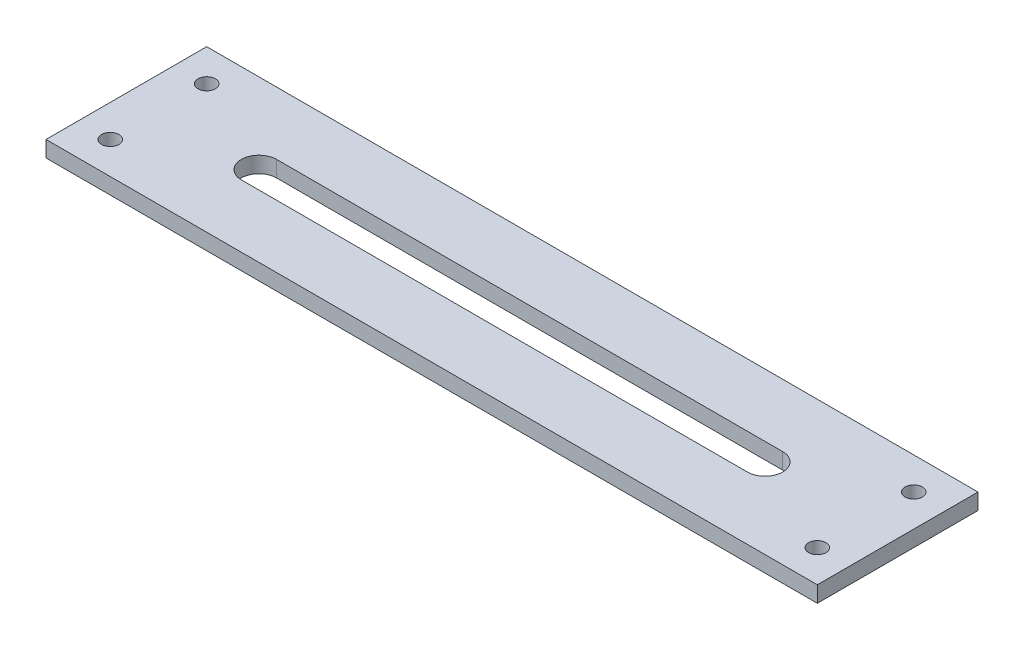
ISO-10303-21;
HEADER;
FILE_DESCRIPTION(('STEP AP214'),'2;1');
FILE_NAME('part.step','',(''),(''),'','','');
FILE_SCHEMA(('AUTOMOTIVE_DESIGN { 1 0 10303 214 1 1 1 1 }'));
ENDSEC;
DATA;
#1=APPLICATION_CONTEXT('core data for automotive mechanical design processes');
#2=APPLICATION_PROTOCOL_DEFINITION('international standard','automotive_design',2000,#1);
#3=PRODUCT_CONTEXT('',#1,'mechanical');
#4=PRODUCT('Part','Part','',(#3));
#5=PRODUCT_RELATED_PRODUCT_CATEGORY('part','',(#4));
#6=PRODUCT_DEFINITION_FORMATION('','',#4);
#7=PRODUCT_DEFINITION_CONTEXT('part definition',#1,'design');
#8=PRODUCT_DEFINITION('design','',#6,#7);
#9=PRODUCT_DEFINITION_SHAPE('','',#8);
#10=(LENGTH_UNIT() NAMED_UNIT(*) SI_UNIT(.MILLI.,.METRE.));
#11=(NAMED_UNIT(*) PLANE_ANGLE_UNIT() SI_UNIT($,.RADIAN.));
#12=(NAMED_UNIT(*) SI_UNIT($,.STERADIAN.) SOLID_ANGLE_UNIT());
#13=UNCERTAINTY_MEASURE_WITH_UNIT(LENGTH_MEASURE(1.E-05),#10,'distance_accuracy_value','');
#14=(GEOMETRIC_REPRESENTATION_CONTEXT(3) GLOBAL_UNCERTAINTY_ASSIGNED_CONTEXT((#13)) GLOBAL_UNIT_ASSIGNED_CONTEXT((#10,
#11,#12)) REPRESENTATION_CONTEXT('',''));
#15=CARTESIAN_POINT('',(0.,0.,0.));
#16=DIRECTION('',(0.,0.,1.));
#17=DIRECTION('',(1.,0.,0.));
#18=AXIS2_PLACEMENT_3D('',#15,#16,#17);
#19=CARTESIAN_POINT('',(0.,6.35,0.));
#20=DIRECTION('',(0.,-1.,0.));
#21=DIRECTION('',(0.,0.,-1.));
#22=AXIS2_PLACEMENT_3D('',#19,#20,#21);
#23=PLANE('',#22);
#24=DIRECTION('',(0.,0.,1.));
#25=VECTOR('',#24,1.);
#26=CARTESIAN_POINT('',(-152.4,6.35,-31.75));
#27=LINE('',#26,#25);
#28=CARTESIAN_POINT('',(-152.4,6.35,-31.75));
#29=VERTEX_POINT('',#28);
#30=CARTESIAN_POINT('',(-152.4,6.35,31.75));
#31=VERTEX_POINT('',#30);
#32=EDGE_CURVE('E137',#29,#31,#27,.T.);
#33=ORIENTED_EDGE('',*,*,#32,.T.);
#34=DIRECTION('',(1.,0.,0.));
#35=VECTOR('',#34,1.);
#36=CARTESIAN_POINT('',(152.4,6.35,31.75));
#37=LINE('',#36,#35);
#38=CARTESIAN_POINT('',(152.4,6.35,31.75));
#39=VERTEX_POINT('',#38);
#40=EDGE_CURVE('E140',#31,#39,#37,.T.);
#41=ORIENTED_EDGE('',*,*,#40,.T.);
#42=DIRECTION('',(0.,0.,-1.));
#43=VECTOR('',#42,1.);
#44=CARTESIAN_POINT('',(152.4,6.35,-31.75));
#45=LINE('',#44,#43);
#46=CARTESIAN_POINT('',(152.4,6.35,-31.75));
#47=VERTEX_POINT('',#46);
#48=EDGE_CURVE('E143',#39,#47,#45,.T.);
#49=ORIENTED_EDGE('',*,*,#48,.T.);
#50=DIRECTION('',(-1.,0.,0.));
#51=VECTOR('',#50,1.);
#52=CARTESIAN_POINT('',(152.4,6.35,-31.75));
#53=LINE('',#52,#51);
#54=EDGE_CURVE('E145',#47,#29,#53,.T.);
#55=ORIENTED_EDGE('',*,*,#54,.T.);
#56=EDGE_LOOP('',(#33,#41,#49,#55));
#57=FACE_BOUND('',#56,.T.);
#58=CARTESIAN_POINT('',(-100.,6.35,0.));
#59=DIRECTION('',(0.,1.,0.));
#60=DIRECTION('',(0.,0.,1.));
#61=AXIS2_PLACEMENT_3D('',#58,#59,#60);
#62=CIRCLE('',#61,6.985);
#63=CARTESIAN_POINT('',(-100.,6.35,-6.985));
#64=VERTEX_POINT('',#63);
#65=CARTESIAN_POINT('',(-100.,6.35,6.985));
#66=VERTEX_POINT('',#65);
#67=EDGE_CURVE('E98',#64,#66,#62,.T.);
#68=ORIENTED_EDGE('',*,*,#67,.F.);
#69=DIRECTION('',(-1.,0.,0.));
#70=VECTOR('',#69,1.);
#71=CARTESIAN_POINT('',(-100.,6.35,-6.985));
#72=LINE('',#71,#70);
#73=CARTESIAN_POINT('',(100.,6.35,-6.985));
#74=VERTEX_POINT('',#73);
#75=EDGE_CURVE('E121',#74,#64,#72,.T.);
#76=ORIENTED_EDGE('',*,*,#75,.F.);
#77=CARTESIAN_POINT('',(100.,6.35,0.));
#78=DIRECTION('',(0.,1.,0.));
#79=DIRECTION('',(0.,0.,1.));
#80=AXIS2_PLACEMENT_3D('',#77,#78,#79);
#81=CIRCLE('',#80,6.985);
#82=CARTESIAN_POINT('',(100.,6.35,6.98499999999996));
#83=VERTEX_POINT('',#82);
#84=EDGE_CURVE('E119',#83,#74,#81,.T.);
#85=ORIENTED_EDGE('',*,*,#84,.F.);
#86=DIRECTION('',(1.,0.,0.));
#87=VECTOR('',#86,1.);
#88=CARTESIAN_POINT('',(-100.,6.35,6.985));
#89=LINE('',#88,#87);
#90=EDGE_CURVE('E106',#66,#83,#89,.T.);
#91=ORIENTED_EDGE('',*,*,#90,.F.);
#92=EDGE_LOOP('',(#68,#76,#85,#91));
#93=FACE_BOUND('',#92,.T.);
#94=CARTESIAN_POINT('',(-139.7,6.35,-19.05));
#95=DIRECTION('',(0.,1.,0.));
#96=DIRECTION('',(0.,0.,1.));
#97=AXIS2_PLACEMENT_3D('',#94,#95,#96);
#98=CIRCLE('',#97,3.429);
#99=CARTESIAN_POINT('',(-139.7,6.35,-15.621));
#100=VERTEX_POINT('',#99);
#101=EDGE_CURVE('E127',#100,#100,#98,.T.);
#102=ORIENTED_EDGE('',*,*,#101,.F.);
#103=EDGE_LOOP('',(#102));
#104=FACE_BOUND('',#103,.T.);
#105=CARTESIAN_POINT('',(139.7,6.35,-19.0499999999993));
#106=DIRECTION('',(0.,1.,0.));
#107=DIRECTION('',(0.,0.,-1.));
#108=AXIS2_PLACEMENT_3D('',#105,#106,#107);
#109=CIRCLE('',#108,3.429);
#110=CARTESIAN_POINT('',(139.7,6.35,-22.4789999999992));
#111=VERTEX_POINT('',#110);
#112=EDGE_CURVE('E249',#111,#111,#109,.T.);
#113=ORIENTED_EDGE('',*,*,#112,.F.);
#114=EDGE_LOOP('',(#113));
#115=FACE_BOUND('',#114,.T.);
#116=CARTESIAN_POINT('',(139.7,6.35,19.049999999999));
#117=DIRECTION('',(0.,1.,0.));
#118=DIRECTION('',(0.,0.,1.));
#119=AXIS2_PLACEMENT_3D('',#116,#117,#118);
#120=CIRCLE('',#119,3.429);
#121=CARTESIAN_POINT('',(139.7,6.35,22.478999999999));
#122=VERTEX_POINT('',#121);
#123=EDGE_CURVE('E243',#122,#122,#120,.T.);
#124=ORIENTED_EDGE('',*,*,#123,.F.);
#125=EDGE_LOOP('',(#124));
#126=FACE_BOUND('',#125,.T.);
#127=CARTESIAN_POINT('',(-139.7,6.35,19.05));
#128=DIRECTION('',(0.,1.,0.));
#129=DIRECTION('',(0.,0.,-1.));
#130=AXIS2_PLACEMENT_3D('',#127,#128,#129);
#131=CIRCLE('',#130,3.429);
#132=CARTESIAN_POINT('',(-139.7,6.35,15.621));
#133=VERTEX_POINT('',#132);
#134=EDGE_CURVE('E234',#133,#133,#131,.T.);
#135=ORIENTED_EDGE('',*,*,#134,.F.);
#136=EDGE_LOOP('',(#135));
#137=FACE_BOUND('',#136,.T.);
#138=ADVANCED_FACE('F33',(#57,#93,#104,#115,#126,#137),#23,.F.);
#139=CARTESIAN_POINT('',(0.,0.,0.));
#140=DIRECTION('',(0.,-1.,0.));
#141=DIRECTION('',(0.,0.,-1.));
#142=AXIS2_PLACEMENT_3D('',#139,#140,#141);
#143=PLANE('',#142);
#144=CARTESIAN_POINT('',(139.7,0.,19.049999999999));
#145=DIRECTION('',(0.,1.,0.));
#146=DIRECTION('',(0.,0.,1.));
#147=AXIS2_PLACEMENT_3D('',#144,#145,#146);
#148=CIRCLE('',#147,3.429);
#149=CARTESIAN_POINT('',(139.7,0.,22.478999999999));
#150=VERTEX_POINT('',#149);
#151=EDGE_CURVE('E240',#150,#150,#148,.T.);
#152=ORIENTED_EDGE('',*,*,#151,.T.);
#153=EDGE_LOOP('',(#152));
#154=FACE_BOUND('',#153,.T.);
#155=CARTESIAN_POINT('',(-139.7,0.,-19.05));
#156=DIRECTION('',(0.,1.,0.));
#157=DIRECTION('',(0.,0.,1.));
#158=AXIS2_PLACEMENT_3D('',#155,#156,#157);
#159=CIRCLE('',#158,3.429);
#160=CARTESIAN_POINT('',(-139.7,0.,-15.621));
#161=VERTEX_POINT('',#160);
#162=EDGE_CURVE('E252',#161,#161,#159,.T.);
#163=ORIENTED_EDGE('',*,*,#162,.T.);
#164=EDGE_LOOP('',(#163));
#165=FACE_BOUND('',#164,.T.);
#166=DIRECTION('',(0.,0.,1.));
#167=VECTOR('',#166,1.);
#168=CARTESIAN_POINT('',(-152.4,0.,-31.75));
#169=LINE('',#168,#167);
#170=CARTESIAN_POINT('',(-152.4,0.,-31.75));
#171=VERTEX_POINT('',#170);
#172=CARTESIAN_POINT('',(-152.4,0.,31.75));
#173=VERTEX_POINT('',#172);
#174=EDGE_CURVE('E114',#171,#173,#169,.T.);
#175=ORIENTED_EDGE('',*,*,#174,.F.);
#176=DIRECTION('',(-1.,0.,0.));
#177=VECTOR('',#176,1.);
#178=CARTESIAN_POINT('',(152.4,0.,-31.75));
#179=LINE('',#178,#177);
#180=CARTESIAN_POINT('',(152.4,0.,-31.75));
#181=VERTEX_POINT('',#180);
#182=EDGE_CURVE('E141',#181,#171,#179,.T.);
#183=ORIENTED_EDGE('',*,*,#182,.F.);
#184=DIRECTION('',(0.,0.,-1.));
#185=VECTOR('',#184,1.);
#186=CARTESIAN_POINT('',(152.4,0.,-31.75));
#187=LINE('',#186,#185);
#188=CARTESIAN_POINT('',(152.4,0.,31.75));
#189=VERTEX_POINT('',#188);
#190=EDGE_CURVE('E152',#189,#181,#187,.T.);
#191=ORIENTED_EDGE('',*,*,#190,.F.);
#192=DIRECTION('',(1.,0.,0.));
#193=VECTOR('',#192,1.);
#194=CARTESIAN_POINT('',(152.4,0.,31.75));
#195=LINE('',#194,#193);
#196=EDGE_CURVE('E150',#173,#189,#195,.T.);
#197=ORIENTED_EDGE('',*,*,#196,.F.);
#198=EDGE_LOOP('',(#175,#183,#191,#197));
#199=FACE_BOUND('',#198,.T.);
#200=DIRECTION('',(-1.,0.,0.));
#201=VECTOR('',#200,1.);
#202=CARTESIAN_POINT('',(-100.,0.,-6.985));
#203=LINE('',#202,#201);
#204=CARTESIAN_POINT('',(100.,0.,-6.985));
#205=VERTEX_POINT('',#204);
#206=CARTESIAN_POINT('',(-100.,0.,-6.985));
#207=VERTEX_POINT('',#206);
#208=EDGE_CURVE('E107',#205,#207,#203,.T.);
#209=ORIENTED_EDGE('',*,*,#208,.T.);
#210=CARTESIAN_POINT('',(-100.,0.,0.));
#211=DIRECTION('',(0.,1.,0.));
#212=DIRECTION('',(0.,0.,1.));
#213=AXIS2_PLACEMENT_3D('',#210,#211,#212);
#214=CIRCLE('',#213,6.985);
#215=CARTESIAN_POINT('',(-100.,0.,6.985));
#216=VERTEX_POINT('',#215);
#217=EDGE_CURVE('E56',#207,#216,#214,.T.);
#218=ORIENTED_EDGE('',*,*,#217,.T.);
#219=DIRECTION('',(1.,0.,0.));
#220=VECTOR('',#219,1.);
#221=CARTESIAN_POINT('',(-100.,0.,6.985));
#222=LINE('',#221,#220);
#223=CARTESIAN_POINT('',(100.,0.,6.98499999999996));
#224=VERTEX_POINT('',#223);
#225=EDGE_CURVE('E113',#216,#224,#222,.T.);
#226=ORIENTED_EDGE('',*,*,#225,.T.);
#227=CARTESIAN_POINT('',(100.,0.,0.));
#228=DIRECTION('',(0.,1.,0.));
#229=DIRECTION('',(0.,0.,1.));
#230=AXIS2_PLACEMENT_3D('',#227,#228,#229);
#231=CIRCLE('',#230,6.985);
#232=EDGE_CURVE('E129',#224,#205,#231,.T.);
#233=ORIENTED_EDGE('',*,*,#232,.T.);
#234=EDGE_LOOP('',(#209,#218,#226,#233));
#235=FACE_BOUND('',#234,.T.);
#236=CARTESIAN_POINT('',(139.7,0.,-19.0499999999993));
#237=DIRECTION('',(0.,1.,0.));
#238=DIRECTION('',(0.,0.,-1.));
#239=AXIS2_PLACEMENT_3D('',#236,#237,#238);
#240=CIRCLE('',#239,3.429);
#241=CARTESIAN_POINT('',(139.7,0.,-22.4789999999992));
#242=VERTEX_POINT('',#241);
#243=EDGE_CURVE('E246',#242,#242,#240,.T.);
#244=ORIENTED_EDGE('',*,*,#243,.T.);
#245=EDGE_LOOP('',(#244));
#246=FACE_BOUND('',#245,.T.);
#247=CARTESIAN_POINT('',(-139.7,0.,19.05));
#248=DIRECTION('',(0.,1.,0.));
#249=DIRECTION('',(0.,0.,-1.));
#250=AXIS2_PLACEMENT_3D('',#247,#248,#249);
#251=CIRCLE('',#250,3.429);
#252=CARTESIAN_POINT('',(-139.7,0.,15.621));
#253=VERTEX_POINT('',#252);
#254=EDGE_CURVE('E237',#253,#253,#251,.T.);
#255=ORIENTED_EDGE('',*,*,#254,.T.);
#256=EDGE_LOOP('',(#255));
#257=FACE_BOUND('',#256,.T.);
#258=ADVANCED_FACE('F170',(#154,#165,#199,#235,#246,#257),#143,.T.);
#259=CARTESIAN_POINT('',(-152.4,6.35,-31.75));
#260=DIRECTION('',(1.,0.,0.));
#261=DIRECTION('',(0.,0.,-1.));
#262=AXIS2_PLACEMENT_3D('',#259,#260,#261);
#263=PLANE('',#262);
#264=ORIENTED_EDGE('',*,*,#174,.T.);
#265=DIRECTION('',(0.,-1.,0.));
#266=VECTOR('',#265,1.);
#267=CARTESIAN_POINT('',(-152.4,6.35,31.75));
#268=LINE('',#267,#266);
#269=EDGE_CURVE('E11',#31,#173,#268,.T.);
#270=ORIENTED_EDGE('',*,*,#269,.F.);
#271=ORIENTED_EDGE('',*,*,#32,.F.);
#272=DIRECTION('',(0.,-1.,0.));
#273=VECTOR('',#272,1.);
#274=CARTESIAN_POINT('',(-152.4,6.35,-31.75));
#275=LINE('',#274,#273);
#276=EDGE_CURVE('E147',#29,#171,#275,.T.);
#277=ORIENTED_EDGE('',*,*,#276,.T.);
#278=EDGE_LOOP('',(#264,#270,#271,#277));
#279=FACE_BOUND('',#278,.T.);
#280=ADVANCED_FACE('F35',(#279),#263,.F.);
#281=CARTESIAN_POINT('',(152.4,6.35,31.75));
#282=DIRECTION('',(0.,0.,-1.));
#283=DIRECTION('',(-1.,0.,0.));
#284=AXIS2_PLACEMENT_3D('',#281,#282,#283);
#285=PLANE('',#284);
#286=ORIENTED_EDGE('',*,*,#196,.T.);
#287=DIRECTION('',(0.,-1.,0.));
#288=VECTOR('',#287,1.);
#289=CARTESIAN_POINT('',(152.4,6.35,31.75));
#290=LINE('',#289,#288);
#291=EDGE_CURVE('E41',#39,#189,#290,.T.);
#292=ORIENTED_EDGE('',*,*,#291,.F.);
#293=ORIENTED_EDGE('',*,*,#40,.F.);
#294=ORIENTED_EDGE('',*,*,#269,.T.);
#295=EDGE_LOOP('',(#286,#292,#293,#294));
#296=FACE_BOUND('',#295,.T.);
#297=ADVANCED_FACE('F180',(#296),#285,.F.);
#298=CARTESIAN_POINT('',(152.4,6.35,-31.75));
#299=DIRECTION('',(-1.,0.,0.));
#300=DIRECTION('',(0.,0.,1.));
#301=AXIS2_PLACEMENT_3D('',#298,#299,#300);
#302=PLANE('',#301);
#303=ORIENTED_EDGE('',*,*,#190,.T.);
#304=DIRECTION('',(0.,-1.,0.));
#305=VECTOR('',#304,1.);
#306=CARTESIAN_POINT('',(152.4,6.35,-31.75));
#307=LINE('',#306,#305);
#308=EDGE_CURVE('E157',#47,#181,#307,.T.);
#309=ORIENTED_EDGE('',*,*,#308,.F.);
#310=ORIENTED_EDGE('',*,*,#48,.F.);
#311=ORIENTED_EDGE('',*,*,#291,.T.);
#312=EDGE_LOOP('',(#303,#309,#310,#311));
#313=FACE_BOUND('',#312,.T.);
#314=ADVANCED_FACE('F164',(#313),#302,.F.);
#315=CARTESIAN_POINT('',(152.4,6.35,-31.75));
#316=DIRECTION('',(0.,0.,1.));
#317=DIRECTION('',(1.,0.,0.));
#318=AXIS2_PLACEMENT_3D('',#315,#316,#317);
#319=PLANE('',#318);
#320=ORIENTED_EDGE('',*,*,#182,.T.);
#321=ORIENTED_EDGE('',*,*,#276,.F.);
#322=ORIENTED_EDGE('',*,*,#54,.F.);
#323=ORIENTED_EDGE('',*,*,#308,.T.);
#324=EDGE_LOOP('',(#320,#321,#322,#323));
#325=FACE_BOUND('',#324,.T.);
#326=ADVANCED_FACE('F174',(#325),#319,.F.);
#327=CARTESIAN_POINT('',(-100.,6.35,0.));
#328=DIRECTION('',(0.,-1.,0.));
#329=DIRECTION('',(0.,0.,-1.));
#330=AXIS2_PLACEMENT_3D('',#327,#328,#329);
#331=CYLINDRICAL_SURFACE('',#330,6.985);
#332=ORIENTED_EDGE('',*,*,#217,.F.);
#333=DIRECTION('',(0.,-1.,0.));
#334=VECTOR('',#333,1.);
#335=CARTESIAN_POINT('',(-100.,6.35,-6.985));
#336=LINE('',#335,#334);
#337=EDGE_CURVE('E102',#64,#207,#336,.T.);
#338=ORIENTED_EDGE('',*,*,#337,.F.);
#339=ORIENTED_EDGE('',*,*,#67,.T.);
#340=DIRECTION('',(0.,-1.,0.));
#341=VECTOR('',#340,1.);
#342=CARTESIAN_POINT('',(-100.,6.35,6.985));
#343=LINE('',#342,#341);
#344=EDGE_CURVE('E101',#66,#216,#343,.T.);
#345=ORIENTED_EDGE('',*,*,#344,.T.);
#346=EDGE_LOOP('',(#332,#338,#339,#345));
#347=FACE_BOUND('',#346,.T.);
#348=ADVANCED_FACE('F100',(#347),#331,.F.);
#349=CARTESIAN_POINT('',(-100.,6.35,6.985));
#350=DIRECTION('',(0.,0.,-1.));
#351=DIRECTION('',(-1.,0.,0.));
#352=AXIS2_PLACEMENT_3D('',#349,#350,#351);
#353=PLANE('',#352);
#354=ORIENTED_EDGE('',*,*,#225,.F.);
#355=ORIENTED_EDGE('',*,*,#344,.F.);
#356=ORIENTED_EDGE('',*,*,#90,.T.);
#357=DIRECTION('',(0.,-1.,0.));
#358=VECTOR('',#357,1.);
#359=CARTESIAN_POINT('',(100.,6.35,6.98499999999996));
#360=LINE('',#359,#358);
#361=EDGE_CURVE('E115',#83,#224,#360,.T.);
#362=ORIENTED_EDGE('',*,*,#361,.T.);
#363=EDGE_LOOP('',(#354,#355,#356,#362));
#364=FACE_BOUND('',#363,.T.);
#365=ADVANCED_FACE('F110',(#364),#353,.T.);
#366=CARTESIAN_POINT('',(100.,6.35,0.));
#367=DIRECTION('',(0.,-1.,0.));
#368=DIRECTION('',(0.,0.,-1.));
#369=AXIS2_PLACEMENT_3D('',#366,#367,#368);
#370=CYLINDRICAL_SURFACE('',#369,6.985);
#371=ORIENTED_EDGE('',*,*,#232,.F.);
#372=ORIENTED_EDGE('',*,*,#361,.F.);
#373=ORIENTED_EDGE('',*,*,#84,.T.);
#374=DIRECTION('',(0.,-1.,0.));
#375=VECTOR('',#374,1.);
#376=CARTESIAN_POINT('',(100.,6.35,-6.985));
#377=LINE('',#376,#375);
#378=EDGE_CURVE('E48',#74,#205,#377,.T.);
#379=ORIENTED_EDGE('',*,*,#378,.T.);
#380=EDGE_LOOP('',(#371,#372,#373,#379));
#381=FACE_BOUND('',#380,.T.);
#382=ADVANCED_FACE('F204',(#381),#370,.F.);
#383=CARTESIAN_POINT('',(-100.,6.35,-6.985));
#384=DIRECTION('',(0.,0.,1.));
#385=DIRECTION('',(1.,0.,0.));
#386=AXIS2_PLACEMENT_3D('',#383,#384,#385);
#387=PLANE('',#386);
#388=ORIENTED_EDGE('',*,*,#208,.F.);
#389=ORIENTED_EDGE('',*,*,#378,.F.);
#390=ORIENTED_EDGE('',*,*,#75,.T.);
#391=ORIENTED_EDGE('',*,*,#337,.T.);
#392=EDGE_LOOP('',(#388,#389,#390,#391));
#393=FACE_BOUND('',#392,.T.);
#394=ADVANCED_FACE('F208',(#393),#387,.T.);
#395=CARTESIAN_POINT('',(-139.7,6.35,-19.05));
#396=DIRECTION('',(0.,-1.,0.));
#397=DIRECTION('',(0.,0.,-1.));
#398=AXIS2_PLACEMENT_3D('',#395,#396,#397);
#399=CYLINDRICAL_SURFACE('',#398,3.429);
#400=ORIENTED_EDGE('',*,*,#101,.T.);
#401=EDGE_LOOP('',(#400));
#402=FACE_BOUND('',#401,.T.);
#403=ORIENTED_EDGE('',*,*,#162,.F.);
#404=EDGE_LOOP('',(#403));
#405=FACE_BOUND('',#404,.T.);
#406=ADVANCED_FACE('F214',(#402,#405),#399,.F.);
#407=CARTESIAN_POINT('',(139.7,6.35,-19.0499999999993));
#408=DIRECTION('',(0.,-1.,0.));
#409=DIRECTION('',(0.,0.,-1.));
#410=AXIS2_PLACEMENT_3D('',#407,#408,#409);
#411=CYLINDRICAL_SURFACE('',#410,3.429);
#412=ORIENTED_EDGE('',*,*,#112,.T.);
#413=EDGE_LOOP('',(#412));
#414=FACE_BOUND('',#413,.T.);
#415=ORIENTED_EDGE('',*,*,#243,.F.);
#416=EDGE_LOOP('',(#415));
#417=FACE_BOUND('',#416,.T.);
#418=ADVANCED_FACE('F217',(#414,#417),#411,.F.);
#419=CARTESIAN_POINT('',(139.7,6.35,19.049999999999));
#420=DIRECTION('',(0.,-1.,0.));
#421=DIRECTION('',(0.,0.,-1.));
#422=AXIS2_PLACEMENT_3D('',#419,#420,#421);
#423=CYLINDRICAL_SURFACE('',#422,3.429);
#424=ORIENTED_EDGE('',*,*,#123,.T.);
#425=EDGE_LOOP('',(#424));
#426=FACE_BOUND('',#425,.T.);
#427=ORIENTED_EDGE('',*,*,#151,.F.);
#428=EDGE_LOOP('',(#427));
#429=FACE_BOUND('',#428,.T.);
#430=ADVANCED_FACE('F221',(#426,#429),#423,.F.);
#431=CARTESIAN_POINT('',(-139.7,6.35,19.05));
#432=DIRECTION('',(0.,-1.,0.));
#433=DIRECTION('',(0.,0.,-1.));
#434=AXIS2_PLACEMENT_3D('',#431,#432,#433);
#435=CYLINDRICAL_SURFACE('',#434,3.429);
#436=ORIENTED_EDGE('',*,*,#134,.T.);
#437=EDGE_LOOP('',(#436));
#438=FACE_BOUND('',#437,.T.);
#439=ORIENTED_EDGE('',*,*,#254,.F.);
#440=EDGE_LOOP('',(#439));
#441=FACE_BOUND('',#440,.T.);
#442=ADVANCED_FACE('F225',(#438,#441),#435,.F.);
#443=CLOSED_SHELL('',(#138,#258,#280,#297,#314,#326,#348,#365,#382,#394,#406,#418,#430,#442));
#444=MANIFOLD_SOLID_BREP('B2',#443);
#445=ADVANCED_BREP_SHAPE_REPRESENTATION('',(#18,#444),#14);
#446=SHAPE_DEFINITION_REPRESENTATION(#9,#445);
ENDSEC;
END-ISO-10303-21;
